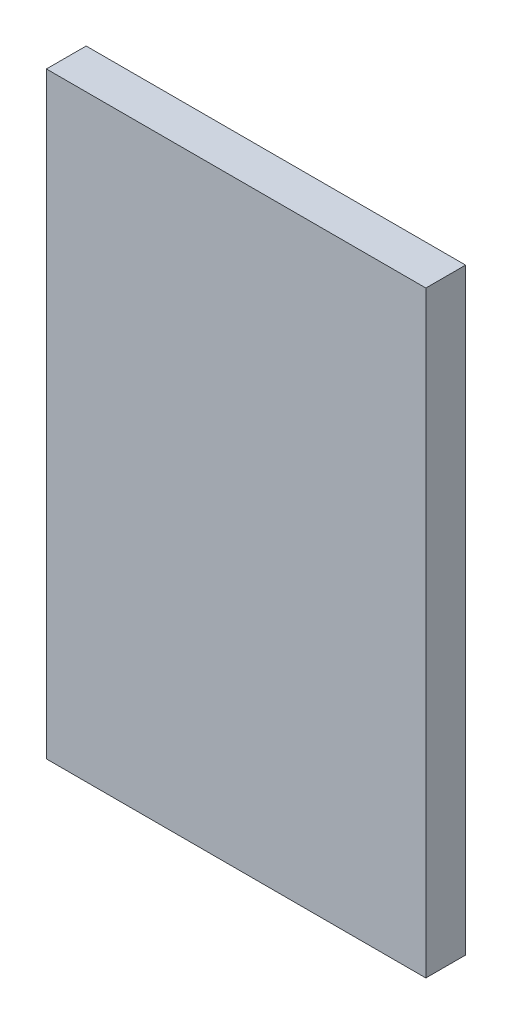
ISO-10303-21;
HEADER;
FILE_DESCRIPTION(('STEP AP214'),'2;1');
FILE_NAME('part.step','',(''),(''),'','','');
FILE_SCHEMA(('AUTOMOTIVE_DESIGN { 1 0 10303 214 1 1 1 1 }'));
ENDSEC;
DATA;
#1=APPLICATION_CONTEXT('core data for automotive mechanical design processes');
#2=APPLICATION_PROTOCOL_DEFINITION('international standard','automotive_design',2000,#1);
#3=PRODUCT_CONTEXT('',#1,'mechanical');
#4=PRODUCT('Part','Part','',(#3));
#5=PRODUCT_RELATED_PRODUCT_CATEGORY('part','',(#4));
#6=PRODUCT_DEFINITION_FORMATION('','',#4);
#7=PRODUCT_DEFINITION_CONTEXT('part definition',#1,'design');
#8=PRODUCT_DEFINITION('design','',#6,#7);
#9=PRODUCT_DEFINITION_SHAPE('','',#8);
#10=(LENGTH_UNIT() NAMED_UNIT(*) SI_UNIT(.MILLI.,.METRE.));
#11=(NAMED_UNIT(*) PLANE_ANGLE_UNIT() SI_UNIT($,.RADIAN.));
#12=(NAMED_UNIT(*) SI_UNIT($,.STERADIAN.) SOLID_ANGLE_UNIT());
#13=UNCERTAINTY_MEASURE_WITH_UNIT(LENGTH_MEASURE(1.E-05),#10,'distance_accuracy_value','');
#14=(GEOMETRIC_REPRESENTATION_CONTEXT(3) GLOBAL_UNCERTAINTY_ASSIGNED_CONTEXT((#13)) GLOBAL_UNIT_ASSIGNED_CONTEXT((#10,
#11,#12)) REPRESENTATION_CONTEXT('',''));
#15=CARTESIAN_POINT('',(0.,0.,0.));
#16=DIRECTION('',(0.,0.,1.));
#17=DIRECTION('',(1.,0.,0.));
#18=AXIS2_PLACEMENT_3D('',#15,#16,#17);
#19=CARTESIAN_POINT('',(0.,0.,2.66));
#20=DIRECTION('',(1.,0.,0.));
#21=DIRECTION('',(0.,1.,0.));
#22=AXIS2_PLACEMENT_3D('',#19,#20,#21);
#23=PLANE('',#22);
#24=DIRECTION('',(0.,-1.,0.));
#25=VECTOR('',#24,1.);
#26=CARTESIAN_POINT('',(0.,0.,0.));
#27=LINE('',#26,#25);
#28=CARTESIAN_POINT('',(0.,40.,0.));
#29=VERTEX_POINT('',#28);
#30=CARTESIAN_POINT('',(0.,0.,0.));
#31=VERTEX_POINT('',#30);
#32=EDGE_CURVE('E111',#29,#31,#27,.T.);
#33=ORIENTED_EDGE('',*,*,#32,.T.);
#34=DIRECTION('',(0.,0.,-1.));
#35=VECTOR('',#34,1.);
#36=CARTESIAN_POINT('',(0.,0.,2.66));
#37=LINE('',#36,#35);
#38=CARTESIAN_POINT('',(0.,0.,2.66));
#39=VERTEX_POINT('',#38);
#40=EDGE_CURVE('E11',#39,#31,#37,.T.);
#41=ORIENTED_EDGE('',*,*,#40,.F.);
#42=DIRECTION('',(0.,-1.,0.));
#43=VECTOR('',#42,1.);
#44=CARTESIAN_POINT('',(0.,0.,2.66));
#45=LINE('',#44,#43);
#46=CARTESIAN_POINT('',(0.,40.,2.66));
#47=VERTEX_POINT('',#46);
#48=EDGE_CURVE('E95',#47,#39,#45,.T.);
#49=ORIENTED_EDGE('',*,*,#48,.F.);
#50=DIRECTION('',(0.,0.,-1.));
#51=VECTOR('',#50,1.);
#52=CARTESIAN_POINT('',(0.,40.,2.66));
#53=LINE('',#52,#51);
#54=EDGE_CURVE('E107',#47,#29,#53,.T.);
#55=ORIENTED_EDGE('',*,*,#54,.T.);
#56=EDGE_LOOP('',(#33,#41,#49,#55));
#57=FACE_BOUND('',#56,.T.);
#58=ADVANCED_FACE('F43',(#57),#23,.F.);
#59=CARTESIAN_POINT('',(0.,0.,2.66));
#60=DIRECTION('',(0.,1.,0.));
#61=DIRECTION('',(0.,0.,1.));
#62=AXIS2_PLACEMENT_3D('',#59,#60,#61);
#63=PLANE('',#62);
#64=DIRECTION('',(1.,0.,0.));
#65=VECTOR('',#64,1.);
#66=CARTESIAN_POINT('',(0.,0.,0.));
#67=LINE('',#66,#65);
#68=CARTESIAN_POINT('',(25.4,0.,0.));
#69=VERTEX_POINT('',#68);
#70=EDGE_CURVE('E100',#31,#69,#67,.T.);
#71=ORIENTED_EDGE('',*,*,#70,.T.);
#72=DIRECTION('',(0.,0.,-1.));
#73=VECTOR('',#72,1.);
#74=CARTESIAN_POINT('',(25.4,0.,2.66));
#75=LINE('',#74,#73);
#76=CARTESIAN_POINT('',(25.4,0.,2.66));
#77=VERTEX_POINT('',#76);
#78=EDGE_CURVE('E52',#77,#69,#75,.T.);
#79=ORIENTED_EDGE('',*,*,#78,.F.);
#80=DIRECTION('',(1.,0.,0.));
#81=VECTOR('',#80,1.);
#82=CARTESIAN_POINT('',(0.,0.,2.66));
#83=LINE('',#82,#81);
#84=EDGE_CURVE('E90',#39,#77,#83,.T.);
#85=ORIENTED_EDGE('',*,*,#84,.F.);
#86=ORIENTED_EDGE('',*,*,#40,.T.);
#87=EDGE_LOOP('',(#71,#79,#85,#86));
#88=FACE_BOUND('',#87,.T.);
#89=ADVANCED_FACE('F99',(#88),#63,.F.);
#90=CARTESIAN_POINT('',(25.4,0.,2.66));
#91=DIRECTION('',(-1.,0.,0.));
#92=DIRECTION('',(0.,-1.,0.));
#93=AXIS2_PLACEMENT_3D('',#90,#91,#92);
#94=PLANE('',#93);
#95=DIRECTION('',(0.,1.,0.));
#96=VECTOR('',#95,1.);
#97=CARTESIAN_POINT('',(25.4,0.,0.));
#98=LINE('',#97,#96);
#99=CARTESIAN_POINT('',(25.4,40.,0.));
#100=VERTEX_POINT('',#99);
#101=EDGE_CURVE('E77',#69,#100,#98,.T.);
#102=ORIENTED_EDGE('',*,*,#101,.T.);
#103=DIRECTION('',(0.,0.,-1.));
#104=VECTOR('',#103,1.);
#105=CARTESIAN_POINT('',(25.4,40.,2.66));
#106=LINE('',#105,#104);
#107=CARTESIAN_POINT('',(25.4,40.,2.66));
#108=VERTEX_POINT('',#107);
#109=EDGE_CURVE('E102',#108,#100,#106,.T.);
#110=ORIENTED_EDGE('',*,*,#109,.F.);
#111=DIRECTION('',(0.,1.,0.));
#112=VECTOR('',#111,1.);
#113=CARTESIAN_POINT('',(25.4,0.,2.66));
#114=LINE('',#113,#112);
#115=EDGE_CURVE('E93',#77,#108,#114,.T.);
#116=ORIENTED_EDGE('',*,*,#115,.F.);
#117=ORIENTED_EDGE('',*,*,#78,.T.);
#118=EDGE_LOOP('',(#102,#110,#116,#117));
#119=FACE_BOUND('',#118,.T.);
#120=ADVANCED_FACE('F103',(#119),#94,.F.);
#121=CARTESIAN_POINT('',(0.,40.,2.66));
#122=DIRECTION('',(0.,-1.,0.));
#123=DIRECTION('',(0.,0.,-1.));
#124=AXIS2_PLACEMENT_3D('',#121,#122,#123);
#125=PLANE('',#124);
#126=DIRECTION('',(-1.,0.,0.));
#127=VECTOR('',#126,1.);
#128=CARTESIAN_POINT('',(0.,40.,0.));
#129=LINE('',#128,#127);
#130=EDGE_CURVE('E83',#100,#29,#129,.T.);
#131=ORIENTED_EDGE('',*,*,#130,.T.);
#132=ORIENTED_EDGE('',*,*,#54,.F.);
#133=DIRECTION('',(-1.,0.,0.));
#134=VECTOR('',#133,1.);
#135=CARTESIAN_POINT('',(0.,40.,2.66));
#136=LINE('',#135,#134);
#137=EDGE_CURVE('E60',#108,#47,#136,.T.);
#138=ORIENTED_EDGE('',*,*,#137,.F.);
#139=ORIENTED_EDGE('',*,*,#109,.T.);
#140=EDGE_LOOP('',(#131,#132,#138,#139));
#141=FACE_BOUND('',#140,.T.);
#142=ADVANCED_FACE('F124',(#141),#125,.F.);
#143=CARTESIAN_POINT('',(0.,0.,2.66));
#144=DIRECTION('',(0.,0.,-1.));
#145=DIRECTION('',(-1.,0.,0.));
#146=AXIS2_PLACEMENT_3D('',#143,#144,#145);
#147=PLANE('',#146);
#148=ORIENTED_EDGE('',*,*,#48,.T.);
#149=ORIENTED_EDGE('',*,*,#84,.T.);
#150=ORIENTED_EDGE('',*,*,#115,.T.);
#151=ORIENTED_EDGE('',*,*,#137,.T.);
#152=EDGE_LOOP('',(#148,#149,#150,#151));
#153=FACE_BOUND('',#152,.T.);
#154=ADVANCED_FACE('F91',(#153),#147,.F.);
#155=CARTESIAN_POINT('',(0.,0.,0.));
#156=DIRECTION('',(0.,0.,-1.));
#157=DIRECTION('',(-1.,0.,0.));
#158=AXIS2_PLACEMENT_3D('',#155,#156,#157);
#159=PLANE('',#158);
#160=ORIENTED_EDGE('',*,*,#32,.F.);
#161=ORIENTED_EDGE('',*,*,#130,.F.);
#162=ORIENTED_EDGE('',*,*,#101,.F.);
#163=ORIENTED_EDGE('',*,*,#70,.F.);
#164=EDGE_LOOP('',(#160,#161,#162,#163));
#165=FACE_BOUND('',#164,.T.);
#166=ADVANCED_FACE('F127',(#165),#159,.T.);
#167=CLOSED_SHELL('',(#58,#89,#120,#142,#154,#166));
#168=MANIFOLD_SOLID_BREP('B2',#167);
#169=ADVANCED_BREP_SHAPE_REPRESENTATION('',(#18,#168),#14);
#170=SHAPE_DEFINITION_REPRESENTATION(#9,#169);
ENDSEC;
END-ISO-10303-21;
